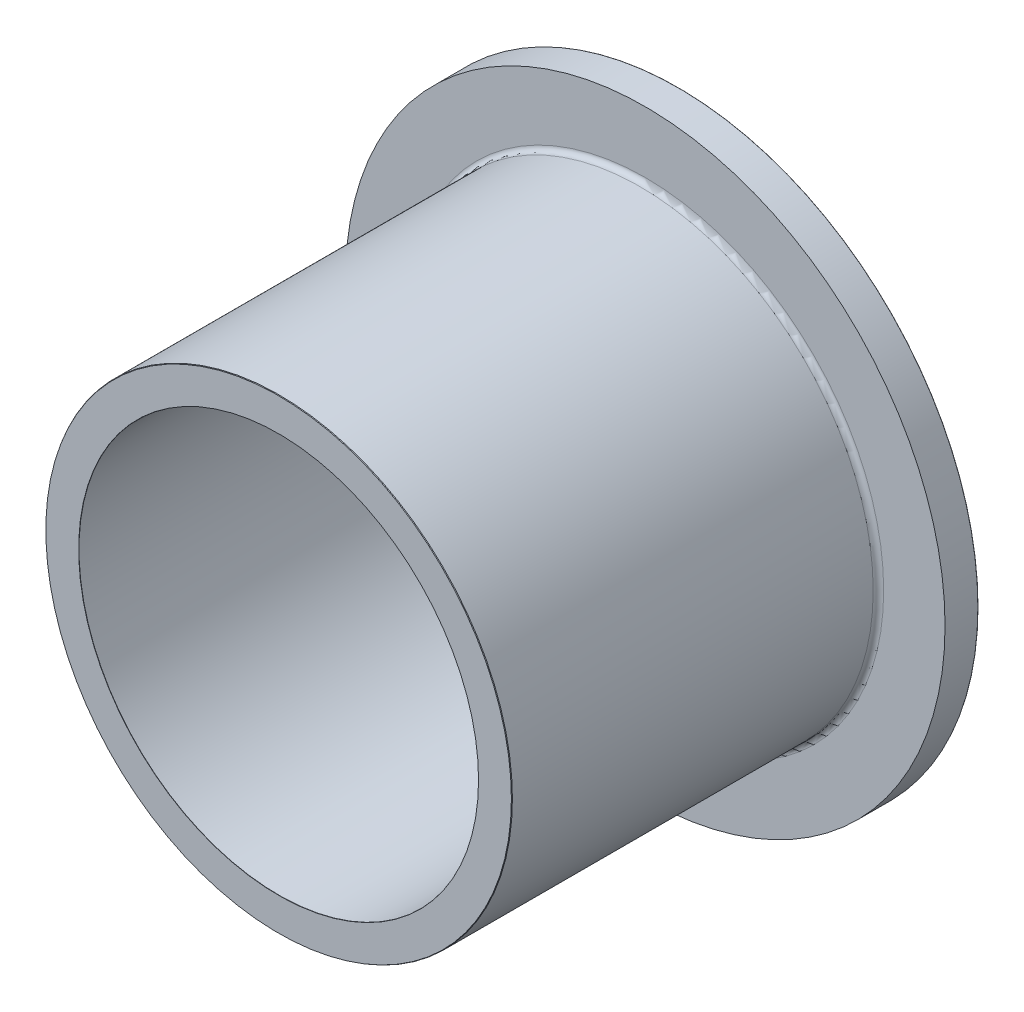
ISO-10303-21;
HEADER;
FILE_DESCRIPTION(('STEP AP214'),'2;1');
FILE_NAME('part.step','',(''),(''),'','','');
FILE_SCHEMA(('AUTOMOTIVE_DESIGN { 1 0 10303 214 1 1 1 1 }'));
ENDSEC;
DATA;
#1=APPLICATION_CONTEXT('core data for automotive mechanical design processes');
#2=APPLICATION_PROTOCOL_DEFINITION('international standard','automotive_design',2000,#1);
#3=PRODUCT_CONTEXT('',#1,'mechanical');
#4=PRODUCT('Part','Part','',(#3));
#5=PRODUCT_RELATED_PRODUCT_CATEGORY('part','',(#4));
#6=PRODUCT_DEFINITION_FORMATION('','',#4);
#7=PRODUCT_DEFINITION_CONTEXT('part definition',#1,'design');
#8=PRODUCT_DEFINITION('design','',#6,#7);
#9=PRODUCT_DEFINITION_SHAPE('','',#8);
#10=(LENGTH_UNIT() NAMED_UNIT(*) SI_UNIT(.MILLI.,.METRE.));
#11=(NAMED_UNIT(*) PLANE_ANGLE_UNIT() SI_UNIT($,.RADIAN.));
#12=(NAMED_UNIT(*) SI_UNIT($,.STERADIAN.) SOLID_ANGLE_UNIT());
#13=UNCERTAINTY_MEASURE_WITH_UNIT(LENGTH_MEASURE(1.E-05),#10,'distance_accuracy_value','');
#14=(GEOMETRIC_REPRESENTATION_CONTEXT(3) GLOBAL_UNCERTAINTY_ASSIGNED_CONTEXT((#13)) GLOBAL_UNIT_ASSIGNED_CONTEXT((#10,
#11,#12)) REPRESENTATION_CONTEXT('',''));
#15=CARTESIAN_POINT('',(0.,0.,0.));
#16=DIRECTION('',(0.,0.,1.));
#17=DIRECTION('',(1.,0.,0.));
#18=AXIS2_PLACEMENT_3D('',#15,#16,#17);
#19=CARTESIAN_POINT('',(0.,0.,19.019000006882));
#20=DIRECTION('',(0.,0.,-1.));
#21=DIRECTION('',(1.,0.,0.));
#22=AXIS2_PLACEMENT_3D('',#19,#20,#21);
#23=CONICAL_SURFACE('',#22,11.1125,0.523598775598);
#24=DIRECTION('',(-0.50000000000019,0.,0.866025403784329));
#25=VECTOR('',#24,1.);
#26=CARTESIAN_POINT('',(11.1125,0.,19.019000006882));
#27=LINE('',#26,#25);
#28=CARTESIAN_POINT('',(11.1125,0.,19.019000006882));
#29=VERTEX_POINT('',#28);
#30=CARTESIAN_POINT('',(11.094602145628,0.,19.05));
#31=VERTEX_POINT('',#30);
#32=EDGE_CURVE('E11',#29,#31,#27,.T.);
#33=ORIENTED_EDGE('',*,*,#32,.F.);
#34=CARTESIAN_POINT('',(0.,0.,19.019000006882));
#35=DIRECTION('',(0.,0.,1.));
#36=DIRECTION('',(1.,0.,0.));
#37=AXIS2_PLACEMENT_3D('',#34,#35,#36);
#38=CIRCLE('',#37,11.1125);
#39=EDGE_CURVE('E117',#29,#29,#38,.T.);
#40=ORIENTED_EDGE('',*,*,#39,.T.);
#41=ORIENTED_EDGE('',*,*,#32,.T.);
#42=CARTESIAN_POINT('',(0.,0.,19.05));
#43=DIRECTION('',(0.,0.,1.));
#44=DIRECTION('',(1.,0.,0.));
#45=AXIS2_PLACEMENT_3D('',#42,#43,#44);
#46=CIRCLE('',#45,11.094602145628);
#47=EDGE_CURVE('E139',#31,#31,#46,.T.);
#48=ORIENTED_EDGE('',*,*,#47,.F.);
#49=EDGE_LOOP('',(#33,#40,#41,#48));
#50=FACE_BOUND('',#49,.T.);
#51=ADVANCED_FACE('F17',(#50),#23,.T.);
#52=CARTESIAN_POINT('',(0.,0.,0.));
#53=DIRECTION('',(0.,0.,-1.));
#54=DIRECTION('',(1.,0.,0.));
#55=AXIS2_PLACEMENT_3D('',#52,#53,#54);
#56=CYLINDRICAL_SURFACE('',#55,11.1125);
#57=ORIENTED_EDGE('',*,*,#39,.F.);
#58=DIRECTION('',(0.,0.,1.));
#59=VECTOR('',#58,1.);
#60=CARTESIAN_POINT('',(11.1125,0.,0.));
#61=LINE('',#60,#59);
#62=CARTESIAN_POINT('',(11.1125,0.,1.8247));
#63=VERTEX_POINT('',#62);
#64=EDGE_CURVE('E28',#63,#29,#61,.T.);
#65=ORIENTED_EDGE('',*,*,#64,.F.);
#66=CARTESIAN_POINT('',(0.,0.,1.8247));
#67=DIRECTION('',(0.,0.,-1.));
#68=DIRECTION('',(1.,0.,0.));
#69=AXIS2_PLACEMENT_3D('',#66,#67,#68);
#70=CIRCLE('',#69,11.1125);
#71=EDGE_CURVE('E21',#63,#63,#70,.T.);
#72=ORIENTED_EDGE('',*,*,#71,.F.);
#73=ORIENTED_EDGE('',*,*,#64,.T.);
#74=EDGE_LOOP('',(#57,#65,#72,#73));
#75=FACE_BOUND('',#74,.T.);
#76=ADVANCED_FACE('F159',(#75),#56,.T.);
#77=CARTESIAN_POINT('',(0.,0.,19.05));
#78=DIRECTION('',(0.,0.,1.));
#79=DIRECTION('',(1.,0.,0.));
#80=AXIS2_PLACEMENT_3D('',#77,#78,#79);
#81=PLANE('',#80);
#82=ORIENTED_EDGE('',*,*,#47,.T.);
#83=EDGE_LOOP('',(#82));
#84=FACE_BOUND('',#83,.T.);
#85=CARTESIAN_POINT('',(0.,0.,19.05));
#86=DIRECTION('',(0.,0.,1.));
#87=DIRECTION('',(1.,0.,0.));
#88=AXIS2_PLACEMENT_3D('',#85,#86,#87);
#89=CIRCLE('',#88,9.529663076582);
#90=CARTESIAN_POINT('',(9.529663076582,0.,19.05));
#91=VERTEX_POINT('',#90);
#92=EDGE_CURVE('E110',#91,#91,#89,.T.);
#93=ORIENTED_EDGE('',*,*,#92,.F.);
#94=EDGE_LOOP('',(#93));
#95=FACE_BOUND('',#94,.T.);
#96=ADVANCED_FACE('F186',(#84,#95),#81,.T.);
#97=CARTESIAN_POINT('',(0.,0.,1.8247));
#98=DIRECTION('',(0.,0.,1.));
#99=DIRECTION('',(1.,0.,0.));
#100=AXIS2_PLACEMENT_3D('',#97,#98,#99);
#101=TOROIDAL_SURFACE('',#100,11.3624,0.2499);
#102=CARTESIAN_POINT('',(11.3624,0.,1.8247));
#103=DIRECTION('',(0.,-1.,0.));
#104=DIRECTION('',(1.,0.,0.));
#105=AXIS2_PLACEMENT_3D('',#102,#103,#104);
#106=CIRCLE('',#105,0.2499);
#107=CARTESIAN_POINT('',(11.3624,0.,1.5748));
#108=VERTEX_POINT('',#107);
#109=EDGE_CURVE('E103',#63,#108,#106,.T.);
#110=ORIENTED_EDGE('',*,*,#109,.F.);
#111=ORIENTED_EDGE('',*,*,#71,.T.);
#112=ORIENTED_EDGE('',*,*,#109,.T.);
#113=CARTESIAN_POINT('',(0.,0.,1.5748));
#114=DIRECTION('',(0.,0.,-1.));
#115=DIRECTION('',(1.,0.,0.));
#116=AXIS2_PLACEMENT_3D('',#113,#114,#115);
#117=CIRCLE('',#116,11.3624);
#118=EDGE_CURVE('E115',#108,#108,#117,.T.);
#119=ORIENTED_EDGE('',*,*,#118,.F.);
#120=EDGE_LOOP('',(#110,#111,#112,#119));
#121=FACE_BOUND('',#120,.T.);
#122=ADVANCED_FACE('F155',(#121),#101,.F.);
#123=CARTESIAN_POINT('',(0.,0.,19.04));
#124=DIRECTION('',(0.,0.,1.));
#125=DIRECTION('',(1.,0.,0.));
#126=AXIS2_PLACEMENT_3D('',#123,#124,#125);
#127=CONICAL_SURFACE('',#126,9.525,0.436332312999);
#128=ORIENTED_EDGE('',*,*,#92,.T.);
#129=DIRECTION('',(0.422618261740812,0.,0.906307787036597));
#130=VECTOR('',#129,1.);
#131=CARTESIAN_POINT('',(9.525,0.,19.04));
#132=LINE('',#131,#130);
#133=CARTESIAN_POINT('',(9.525,0.,19.04));
#134=VERTEX_POINT('',#133);
#135=EDGE_CURVE('E114',#134,#91,#132,.T.);
#136=ORIENTED_EDGE('',*,*,#135,.F.);
#137=CARTESIAN_POINT('',(0.,0.,19.04));
#138=DIRECTION('',(0.,0.,1.));
#139=DIRECTION('',(1.,0.,0.));
#140=AXIS2_PLACEMENT_3D('',#137,#138,#139);
#141=CIRCLE('',#140,9.525);
#142=EDGE_CURVE('E123',#134,#134,#141,.T.);
#143=ORIENTED_EDGE('',*,*,#142,.F.);
#144=ORIENTED_EDGE('',*,*,#135,.T.);
#145=EDGE_LOOP('',(#128,#136,#143,#144));
#146=FACE_BOUND('',#145,.T.);
#147=ADVANCED_FACE('F170',(#146),#127,.F.);
#148=CARTESIAN_POINT('',(0.,0.,1.5748));
#149=DIRECTION('',(0.,0.,1.));
#150=DIRECTION('',(1.,0.,0.));
#151=AXIS2_PLACEMENT_3D('',#148,#149,#150);
#152=PLANE('',#151);
#153=CARTESIAN_POINT('',(0.,0.,1.5748));
#154=DIRECTION('',(0.,0.,1.));
#155=DIRECTION('',(1.,0.,0.));
#156=AXIS2_PLACEMENT_3D('',#153,#154,#155);
#157=CIRCLE('',#156,14.2875);
#158=CARTESIAN_POINT('',(14.2875,0.,1.5748));
#159=VERTEX_POINT('',#158);
#160=EDGE_CURVE('E109',#159,#159,#157,.T.);
#161=ORIENTED_EDGE('',*,*,#160,.T.);
#162=EDGE_LOOP('',(#161));
#163=FACE_BOUND('',#162,.T.);
#164=ORIENTED_EDGE('',*,*,#118,.T.);
#165=EDGE_LOOP('',(#164));
#166=FACE_BOUND('',#165,.T.);
#167=ADVANCED_FACE('F167',(#163,#166),#152,.T.);
#168=CARTESIAN_POINT('',(0.,0.,0.));
#169=DIRECTION('',(0.,0.,-1.));
#170=DIRECTION('',(1.,0.,0.));
#171=AXIS2_PLACEMENT_3D('',#168,#169,#170);
#172=CYLINDRICAL_SURFACE('',#171,9.525);
#173=DIRECTION('',(0.,0.,1.));
#174=VECTOR('',#173,1.);
#175=CARTESIAN_POINT('',(9.525,0.,0.));
#176=LINE('',#175,#174);
#177=CARTESIAN_POINT('',(9.525,0.,0.01));
#178=VERTEX_POINT('',#177);
#179=EDGE_CURVE('E120',#178,#134,#176,.T.);
#180=ORIENTED_EDGE('',*,*,#179,.T.);
#181=ORIENTED_EDGE('',*,*,#142,.T.);
#182=ORIENTED_EDGE('',*,*,#179,.F.);
#183=CARTESIAN_POINT('',(0.,0.,0.01));
#184=DIRECTION('',(0.,0.,1.));
#185=DIRECTION('',(1.,0.,0.));
#186=AXIS2_PLACEMENT_3D('',#183,#184,#185);
#187=CIRCLE('',#186,9.525);
#188=EDGE_CURVE('E85',#178,#178,#187,.T.);
#189=ORIENTED_EDGE('',*,*,#188,.F.);
#190=EDGE_LOOP('',(#180,#181,#182,#189));
#191=FACE_BOUND('',#190,.T.);
#192=ADVANCED_FACE('F169',(#191),#172,.F.);
#193=CARTESIAN_POINT('',(0.,0.,0.));
#194=DIRECTION('',(0.,0.,-1.));
#195=DIRECTION('',(1.,0.,0.));
#196=AXIS2_PLACEMENT_3D('',#193,#194,#195);
#197=CYLINDRICAL_SURFACE('',#196,14.2875);
#198=CARTESIAN_POINT('',(0.,0.,0.01));
#199=DIRECTION('',(0.,0.,1.));
#200=DIRECTION('',(1.,0.,0.));
#201=AXIS2_PLACEMENT_3D('',#198,#199,#200);
#202=CIRCLE('',#201,14.2875);
#203=CARTESIAN_POINT('',(14.2875,0.,0.01));
#204=VERTEX_POINT('',#203);
#205=EDGE_CURVE('E87',#204,#204,#202,.T.);
#206=ORIENTED_EDGE('',*,*,#205,.T.);
#207=DIRECTION('',(0.,0.,1.));
#208=VECTOR('',#207,1.);
#209=CARTESIAN_POINT('',(14.2875,0.,0.));
#210=LINE('',#209,#208);
#211=EDGE_CURVE('E105',#204,#159,#210,.T.);
#212=ORIENTED_EDGE('',*,*,#211,.T.);
#213=ORIENTED_EDGE('',*,*,#160,.F.);
#214=ORIENTED_EDGE('',*,*,#211,.F.);
#215=EDGE_LOOP('',(#206,#212,#213,#214));
#216=FACE_BOUND('',#215,.T.);
#217=ADVANCED_FACE('F177',(#216),#197,.T.);
#218=CARTESIAN_POINT('',(0.,0.,0.01));
#219=DIRECTION('',(0.,0.,-1.));
#220=DIRECTION('',(1.,0.,0.));
#221=AXIS2_PLACEMENT_3D('',#218,#219,#220);
#222=CONICAL_SURFACE('',#221,9.525,0.436332312999);
#223=DIRECTION('',(0.422618261740812,0.,-0.906307787036597));
#224=VECTOR('',#223,1.);
#225=CARTESIAN_POINT('',(9.525,0.,0.01));
#226=LINE('',#225,#224);
#227=CARTESIAN_POINT('',(9.529663076582,0.,0.));
#228=VERTEX_POINT('',#227);
#229=EDGE_CURVE('E80',#178,#228,#226,.T.);
#230=ORIENTED_EDGE('',*,*,#229,.F.);
#231=ORIENTED_EDGE('',*,*,#188,.T.);
#232=ORIENTED_EDGE('',*,*,#229,.T.);
#233=CARTESIAN_POINT('',(0.,0.,0.));
#234=DIRECTION('',(0.,0.,1.));
#235=DIRECTION('',(1.,0.,0.));
#236=AXIS2_PLACEMENT_3D('',#233,#234,#235);
#237=CIRCLE('',#236,9.529663076582);
#238=EDGE_CURVE('E83',#228,#228,#237,.T.);
#239=ORIENTED_EDGE('',*,*,#238,.F.);
#240=EDGE_LOOP('',(#230,#231,#232,#239));
#241=FACE_BOUND('',#240,.T.);
#242=ADVANCED_FACE('F82',(#241),#222,.F.);
#243=CARTESIAN_POINT('',(0.,0.,0.01));
#244=DIRECTION('',(0.,0.,1.));
#245=DIRECTION('',(1.,0.,0.));
#246=AXIS2_PLACEMENT_3D('',#243,#244,#245);
#247=CONICAL_SURFACE('',#246,14.2875,0.436332312999);
#248=CARTESIAN_POINT('',(0.,0.,0.));
#249=DIRECTION('',(0.,0.,1.));
#250=DIRECTION('',(1.,0.,0.));
#251=AXIS2_PLACEMENT_3D('',#248,#249,#250);
#252=CIRCLE('',#251,14.282836923418);
#253=CARTESIAN_POINT('',(14.282836923418,0.,0.));
#254=VERTEX_POINT('',#253);
#255=EDGE_CURVE('E93',#254,#254,#252,.T.);
#256=ORIENTED_EDGE('',*,*,#255,.T.);
#257=DIRECTION('',(-0.422618261740812,0.,-0.906307787036597));
#258=VECTOR('',#257,1.);
#259=CARTESIAN_POINT('',(14.2875,0.,0.01));
#260=LINE('',#259,#258);
#261=EDGE_CURVE('E92',#204,#254,#260,.T.);
#262=ORIENTED_EDGE('',*,*,#261,.F.);
#263=ORIENTED_EDGE('',*,*,#205,.F.);
#264=ORIENTED_EDGE('',*,*,#261,.T.);
#265=EDGE_LOOP('',(#256,#262,#263,#264));
#266=FACE_BOUND('',#265,.T.);
#267=ADVANCED_FACE('F189',(#266),#247,.T.);
#268=CARTESIAN_POINT('',(0.,0.,0.));
#269=DIRECTION('',(0.,0.,1.));
#270=DIRECTION('',(1.,0.,0.));
#271=AXIS2_PLACEMENT_3D('',#268,#269,#270);
#272=PLANE('',#271);
#273=ORIENTED_EDGE('',*,*,#238,.T.);
#274=EDGE_LOOP('',(#273));
#275=FACE_BOUND('',#274,.T.);
#276=ORIENTED_EDGE('',*,*,#255,.F.);
#277=EDGE_LOOP('',(#276));
#278=FACE_BOUND('',#277,.T.);
#279=ADVANCED_FACE('F19',(#275,#278),#272,.F.);
#280=CLOSED_SHELL('',(#51,#76,#96,#122,#147,#167,#192,#217,#242,#267,#279));
#281=MANIFOLD_SOLID_BREP('B1',#280);
#282=ADVANCED_BREP_SHAPE_REPRESENTATION('',(#18,#281),#14);
#283=SHAPE_DEFINITION_REPRESENTATION(#9,#282);
ENDSEC;
END-ISO-10303-21;
